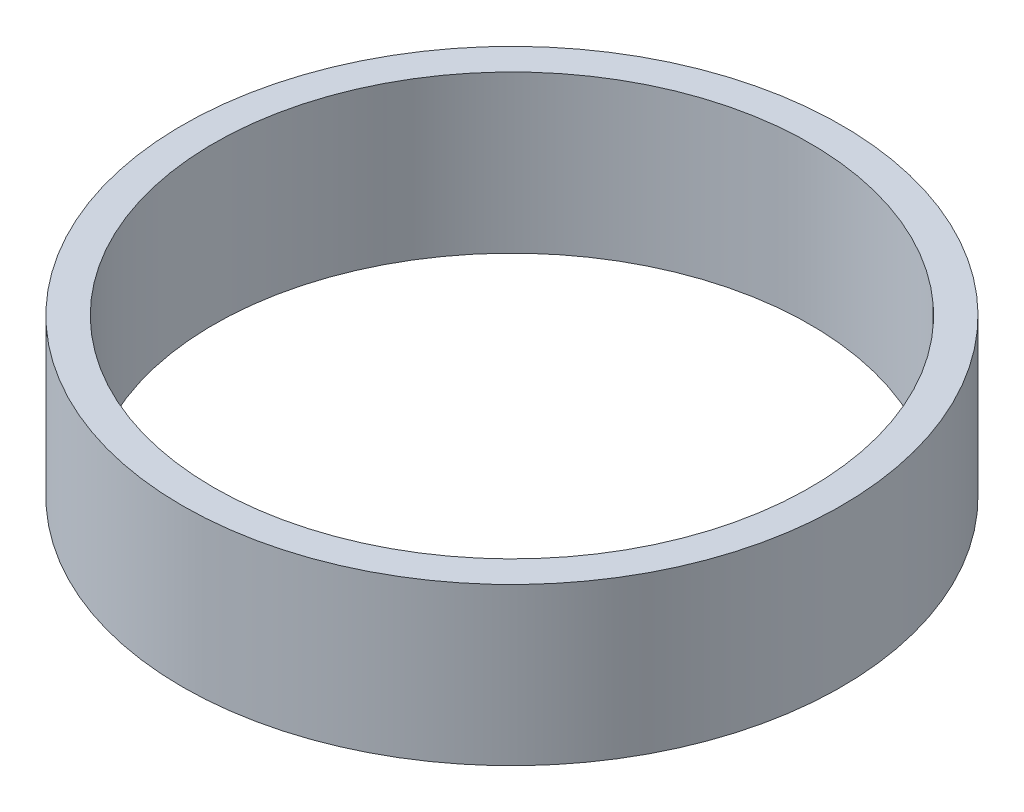
ISO-10303-21;
HEADER;
FILE_DESCRIPTION(('STEP AP214'),'2;1');
FILE_NAME('part.step','',(''),(''),'','','');
FILE_SCHEMA(('AUTOMOTIVE_DESIGN { 1 0 10303 214 1 1 1 1 }'));
ENDSEC;
DATA;
#1=APPLICATION_CONTEXT('core data for automotive mechanical design processes');
#2=APPLICATION_PROTOCOL_DEFINITION('international standard','automotive_design',2000,#1);
#3=PRODUCT_CONTEXT('',#1,'mechanical');
#4=PRODUCT('Part','Part','',(#3));
#5=PRODUCT_RELATED_PRODUCT_CATEGORY('part','',(#4));
#6=PRODUCT_DEFINITION_FORMATION('','',#4);
#7=PRODUCT_DEFINITION_CONTEXT('part definition',#1,'design');
#8=PRODUCT_DEFINITION('design','',#6,#7);
#9=PRODUCT_DEFINITION_SHAPE('','',#8);
#10=(LENGTH_UNIT() NAMED_UNIT(*) SI_UNIT(.MILLI.,.METRE.));
#11=(NAMED_UNIT(*) PLANE_ANGLE_UNIT() SI_UNIT($,.RADIAN.));
#12=(NAMED_UNIT(*) SI_UNIT($,.STERADIAN.) SOLID_ANGLE_UNIT());
#13=UNCERTAINTY_MEASURE_WITH_UNIT(LENGTH_MEASURE(1.E-05),#10,'distance_accuracy_value','');
#14=(GEOMETRIC_REPRESENTATION_CONTEXT(3) GLOBAL_UNCERTAINTY_ASSIGNED_CONTEXT((#13)) GLOBAL_UNIT_ASSIGNED_CONTEXT((#10,
#11,#12)) REPRESENTATION_CONTEXT('',''));
#15=CARTESIAN_POINT('',(0.,0.,0.));
#16=DIRECTION('',(0.,0.,1.));
#17=DIRECTION('',(1.,0.,0.));
#18=AXIS2_PLACEMENT_3D('',#15,#16,#17);
#19=CARTESIAN_POINT('',(0.,0.,0.));
#20=DIRECTION('',(0.,1.,0.));
#21=DIRECTION('',(0.,0.,1.));
#22=AXIS2_PLACEMENT_3D('',#19,#20,#21);
#23=PLANE('',#22);
#24=CARTESIAN_POINT('',(0.,0.,0.));
#25=DIRECTION('',(0.,1.,0.));
#26=DIRECTION('',(0.,0.,1.));
#27=AXIS2_PLACEMENT_3D('',#24,#25,#26);
#28=CIRCLE('',#27,21.);
#29=CARTESIAN_POINT('',(0.,0.,21.));
#30=VERTEX_POINT('',#29);
#31=EDGE_CURVE('E13',#30,#30,#28,.T.);
#32=ORIENTED_EDGE('',*,*,#31,.F.);
#33=EDGE_LOOP('',(#32));
#34=FACE_BOUND('',#33,.T.);
#35=CARTESIAN_POINT('',(0.,0.,0.));
#36=DIRECTION('',(0.,1.,0.));
#37=DIRECTION('',(0.,0.,1.));
#38=AXIS2_PLACEMENT_3D('',#35,#36,#37);
#39=CIRCLE('',#38,19.);
#40=CARTESIAN_POINT('',(0.,0.,19.));
#41=VERTEX_POINT('',#40);
#42=EDGE_CURVE('E1300',#41,#41,#39,.T.);
#43=ORIENTED_EDGE('',*,*,#42,.T.);
#44=EDGE_LOOP('',(#43));
#45=FACE_BOUND('',#44,.T.);
#46=ADVANCED_FACE('F1292',(#34,#45),#23,.F.);
#47=CARTESIAN_POINT('',(0.,1.,0.));
#48=DIRECTION('',(0.,-1.,0.));
#49=DIRECTION('',(0.,0.,-1.));
#50=AXIS2_PLACEMENT_3D('',#47,#48,#49);
#51=CYLINDRICAL_SURFACE('',#50,21.);
#52=ORIENTED_EDGE('',*,*,#31,.T.);
#53=EDGE_LOOP('',(#52));
#54=FACE_BOUND('',#53,.T.);
#55=CARTESIAN_POINT('',(0.,10.,0.));
#56=DIRECTION('',(0.,1.,0.));
#57=DIRECTION('',(0.,0.,1.));
#58=AXIS2_PLACEMENT_3D('',#55,#56,#57);
#59=CIRCLE('',#58,21.);
#60=CARTESIAN_POINT('',(0.,10.,21.));
#61=VERTEX_POINT('',#60);
#62=EDGE_CURVE('E1301',#61,#61,#59,.T.);
#63=ORIENTED_EDGE('',*,*,#62,.F.);
#64=EDGE_LOOP('',(#63));
#65=FACE_BOUND('',#64,.T.);
#66=ADVANCED_FACE('F1293',(#54,#65),#51,.T.);
#67=CARTESIAN_POINT('',(0.,1.,0.));
#68=DIRECTION('',(0.,-1.,0.));
#69=DIRECTION('',(0.,0.,-1.));
#70=AXIS2_PLACEMENT_3D('',#67,#68,#69);
#71=CYLINDRICAL_SURFACE('',#70,19.);
#72=ORIENTED_EDGE('',*,*,#42,.F.);
#73=EDGE_LOOP('',(#72));
#74=FACE_BOUND('',#73,.T.);
#75=CARTESIAN_POINT('',(0.,10.,0.));
#76=DIRECTION('',(0.,1.,0.));
#77=DIRECTION('',(0.,0.,1.));
#78=AXIS2_PLACEMENT_3D('',#75,#76,#77);
#79=CIRCLE('',#78,19.);
#80=CARTESIAN_POINT('',(0.,10.,19.));
#81=VERTEX_POINT('',#80);
#82=EDGE_CURVE('E1310',#81,#81,#79,.T.);
#83=ORIENTED_EDGE('',*,*,#82,.T.);
#84=EDGE_LOOP('',(#83));
#85=FACE_BOUND('',#84,.T.);
#86=ADVANCED_FACE('F1313',(#74,#85),#71,.F.);
#87=CARTESIAN_POINT('',(0.,10.,0.));
#88=DIRECTION('',(0.,1.,0.));
#89=DIRECTION('',(0.,0.,1.));
#90=AXIS2_PLACEMENT_3D('',#87,#88,#89);
#91=PLANE('',#90);
#92=ORIENTED_EDGE('',*,*,#62,.T.);
#93=EDGE_LOOP('',(#92));
#94=FACE_BOUND('',#93,.T.);
#95=ORIENTED_EDGE('',*,*,#82,.F.);
#96=EDGE_LOOP('',(#95));
#97=FACE_BOUND('',#96,.T.);
#98=ADVANCED_FACE('F1314',(#94,#97),#91,.T.);
#99=CLOSED_SHELL('',(#46,#66,#86,#98));
#100=MANIFOLD_SOLID_BREP('B2',#99);
#101=ADVANCED_BREP_SHAPE_REPRESENTATION('',(#18,#100),#14);
#102=SHAPE_DEFINITION_REPRESENTATION(#9,#101);
ENDSEC;
END-ISO-10303-21;
